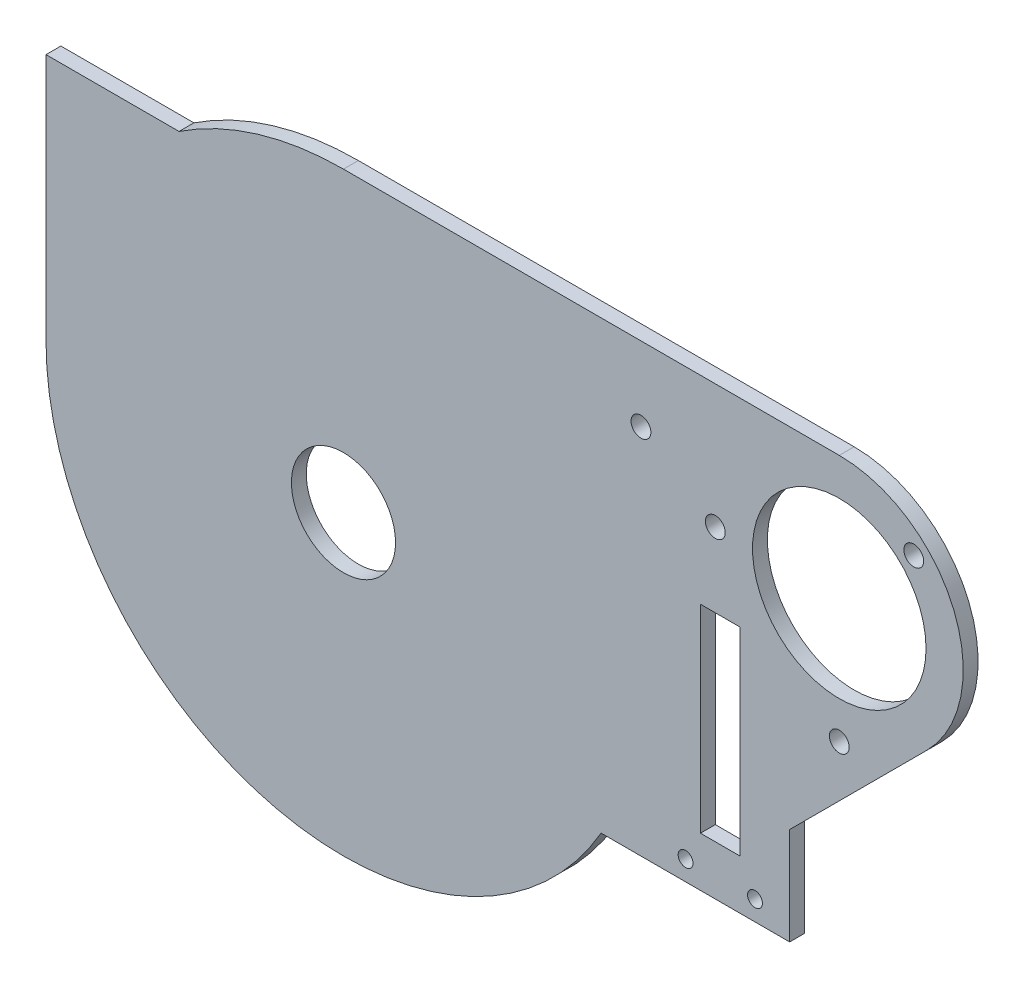
ISO-10303-21;
HEADER;
FILE_DESCRIPTION(('STEP AP214'),'2;1');
FILE_NAME('part.step','',(''),(''),'','','');
FILE_SCHEMA(('AUTOMOTIVE_DESIGN { 1 0 10303 214 1 1 1 1 }'));
ENDSEC;
DATA;
#1=APPLICATION_CONTEXT('core data for automotive mechanical design processes');
#2=APPLICATION_PROTOCOL_DEFINITION('international standard','automotive_design',2000,#1);
#3=PRODUCT_CONTEXT('',#1,'mechanical');
#4=PRODUCT('Part','Part','',(#3));
#5=PRODUCT_RELATED_PRODUCT_CATEGORY('part','',(#4));
#6=PRODUCT_DEFINITION_FORMATION('','',#4);
#7=PRODUCT_DEFINITION_CONTEXT('part definition',#1,'design');
#8=PRODUCT_DEFINITION('design','',#6,#7);
#9=PRODUCT_DEFINITION_SHAPE('','',#8);
#10=(LENGTH_UNIT() NAMED_UNIT(*) SI_UNIT(.MILLI.,.METRE.));
#11=(NAMED_UNIT(*) PLANE_ANGLE_UNIT() SI_UNIT($,.RADIAN.));
#12=(NAMED_UNIT(*) SI_UNIT($,.STERADIAN.) SOLID_ANGLE_UNIT());
#13=UNCERTAINTY_MEASURE_WITH_UNIT(LENGTH_MEASURE(1.E-05),#10,'distance_accuracy_value','');
#14=(GEOMETRIC_REPRESENTATION_CONTEXT(3) GLOBAL_UNCERTAINTY_ASSIGNED_CONTEXT((#13)) GLOBAL_UNIT_ASSIGNED_CONTEXT((#10,
#11,#12)) REPRESENTATION_CONTEXT('',''));
#15=CARTESIAN_POINT('',(0.,0.,0.));
#16=DIRECTION('',(0.,0.,1.));
#17=DIRECTION('',(1.,0.,0.));
#18=AXIS2_PLACEMENT_3D('',#15,#16,#17);
#19=CARTESIAN_POINT('',(0.,20.,3.));
#20=DIRECTION('',(0.,1.,0.));
#21=DIRECTION('',(0.,0.,1.));
#22=AXIS2_PLACEMENT_3D('',#19,#20,#21);
#23=PLANE('',#22);
#24=DIRECTION('',(1.,0.,0.));
#25=VECTOR('',#24,1.);
#26=CARTESIAN_POINT('',(0.,20.,0.));
#27=LINE('',#26,#25);
#28=CARTESIAN_POINT('',(72.,20.,0.));
#29=VERTEX_POINT('',#28);
#30=CARTESIAN_POINT('',(80.,20.,0.));
#31=VERTEX_POINT('',#30);
#32=EDGE_CURVE('E200',#29,#31,#27,.T.);
#33=ORIENTED_EDGE('',*,*,#32,.T.);
#34=DIRECTION('',(0.,0.,-1.));
#35=VECTOR('',#34,1.);
#36=CARTESIAN_POINT('',(80.,20.,3.));
#37=LINE('',#36,#35);
#38=CARTESIAN_POINT('',(80.,20.,3.));
#39=VERTEX_POINT('',#38);
#40=EDGE_CURVE('E11',#39,#31,#37,.T.);
#41=ORIENTED_EDGE('',*,*,#40,.F.);
#42=DIRECTION('',(1.,0.,0.));
#43=VECTOR('',#42,1.);
#44=CARTESIAN_POINT('',(0.,20.,3.));
#45=LINE('',#44,#43);
#46=CARTESIAN_POINT('',(72.,20.,3.));
#47=VERTEX_POINT('',#46);
#48=EDGE_CURVE('E147',#47,#39,#45,.T.);
#49=ORIENTED_EDGE('',*,*,#48,.F.);
#50=DIRECTION('',(0.,0.,-1.));
#51=VECTOR('',#50,1.);
#52=CARTESIAN_POINT('',(72.,20.,3.));
#53=LINE('',#52,#51);
#54=EDGE_CURVE('E56',#47,#29,#53,.T.);
#55=ORIENTED_EDGE('',*,*,#54,.T.);
#56=EDGE_LOOP('',(#33,#41,#49,#55));
#57=FACE_BOUND('',#56,.T.);
#58=ADVANCED_FACE('F37',(#57),#23,.F.);
#59=CARTESIAN_POINT('',(80.,0.,3.));
#60=DIRECTION('',(1.,0.,0.));
#61=DIRECTION('',(0.,0.,-1.));
#62=AXIS2_PLACEMENT_3D('',#59,#60,#61);
#63=PLANE('',#62);
#64=DIRECTION('',(0.,-1.,0.));
#65=VECTOR('',#64,1.);
#66=CARTESIAN_POINT('',(80.,0.,0.));
#67=LINE('',#66,#65);
#68=CARTESIAN_POINT('',(80.,-20.,0.));
#69=VERTEX_POINT('',#68);
#70=EDGE_CURVE('E153',#31,#69,#67,.T.);
#71=ORIENTED_EDGE('',*,*,#70,.T.);
#72=DIRECTION('',(0.,0.,-1.));
#73=VECTOR('',#72,1.);
#74=CARTESIAN_POINT('',(80.,-20.,3.));
#75=LINE('',#74,#73);
#76=CARTESIAN_POINT('',(80.,-20.,3.));
#77=VERTEX_POINT('',#76);
#78=EDGE_CURVE('E47',#77,#69,#75,.T.);
#79=ORIENTED_EDGE('',*,*,#78,.F.);
#80=DIRECTION('',(0.,-1.,0.));
#81=VECTOR('',#80,1.);
#82=CARTESIAN_POINT('',(80.,0.,3.));
#83=LINE('',#82,#81);
#84=EDGE_CURVE('E140',#39,#77,#83,.T.);
#85=ORIENTED_EDGE('',*,*,#84,.F.);
#86=ORIENTED_EDGE('',*,*,#40,.T.);
#87=EDGE_LOOP('',(#71,#79,#85,#86));
#88=FACE_BOUND('',#87,.T.);
#89=ADVANCED_FACE('F152',(#88),#63,.F.);
#90=CARTESIAN_POINT('',(0.,-20.,3.));
#91=DIRECTION('',(0.,1.,0.));
#92=DIRECTION('',(0.,0.,1.));
#93=AXIS2_PLACEMENT_3D('',#90,#91,#92);
#94=PLANE('',#93);
#95=DIRECTION('',(1.,0.,0.));
#96=VECTOR('',#95,1.);
#97=CARTESIAN_POINT('',(0.,-20.,0.));
#98=LINE('',#97,#96);
#99=CARTESIAN_POINT('',(72.,-20.,0.));
#100=VERTEX_POINT('',#99);
#101=EDGE_CURVE('E203',#100,#69,#98,.T.);
#102=ORIENTED_EDGE('',*,*,#101,.F.);
#103=DIRECTION('',(0.,0.,-1.));
#104=VECTOR('',#103,1.);
#105=CARTESIAN_POINT('',(72.,-20.,3.));
#106=LINE('',#105,#104);
#107=CARTESIAN_POINT('',(72.,-20.,3.));
#108=VERTEX_POINT('',#107);
#109=EDGE_CURVE('E97',#108,#100,#106,.T.);
#110=ORIENTED_EDGE('',*,*,#109,.F.);
#111=DIRECTION('',(1.,0.,0.));
#112=VECTOR('',#111,1.);
#113=CARTESIAN_POINT('',(0.,-20.,3.));
#114=LINE('',#113,#112);
#115=EDGE_CURVE('E146',#108,#77,#114,.T.);
#116=ORIENTED_EDGE('',*,*,#115,.T.);
#117=ORIENTED_EDGE('',*,*,#78,.T.);
#118=EDGE_LOOP('',(#102,#110,#116,#117));
#119=FACE_BOUND('',#118,.T.);
#120=ADVANCED_FACE('F157',(#119),#94,.T.);
#121=CARTESIAN_POINT('',(-60.,0.,3.));
#122=DIRECTION('',(-1.,0.,0.));
#123=DIRECTION('',(0.,0.,1.));
#124=AXIS2_PLACEMENT_3D('',#121,#122,#123);
#125=PLANE('',#124);
#126=DIRECTION('',(0.,1.,0.));
#127=VECTOR('',#126,1.);
#128=CARTESIAN_POINT('',(-60.,0.,0.));
#129=LINE('',#128,#127);
#130=CARTESIAN_POINT('',(-60.,0.,0.));
#131=VERTEX_POINT('',#130);
#132=CARTESIAN_POINT('',(-60.,50.,0.));
#133=VERTEX_POINT('',#132);
#134=EDGE_CURVE('E173',#131,#133,#129,.T.);
#135=ORIENTED_EDGE('',*,*,#134,.F.);
#136=DIRECTION('',(0.,0.,-1.));
#137=VECTOR('',#136,1.);
#138=CARTESIAN_POINT('',(-60.,0.,3.));
#139=LINE('',#138,#137);
#140=CARTESIAN_POINT('',(-60.,0.,3.));
#141=VERTEX_POINT('',#140);
#142=EDGE_CURVE('E41',#141,#131,#139,.T.);
#143=ORIENTED_EDGE('',*,*,#142,.F.);
#144=DIRECTION('',(0.,1.,0.));
#145=VECTOR('',#144,1.);
#146=CARTESIAN_POINT('',(-60.,0.,3.));
#147=LINE('',#146,#145);
#148=CARTESIAN_POINT('',(-60.,50.,3.));
#149=VERTEX_POINT('',#148);
#150=EDGE_CURVE('E217',#141,#149,#147,.T.);
#151=ORIENTED_EDGE('',*,*,#150,.T.);
#152=DIRECTION('',(0.,0.,-1.));
#153=VECTOR('',#152,1.);
#154=CARTESIAN_POINT('',(-60.,50.,3.));
#155=LINE('',#154,#153);
#156=EDGE_CURVE('E172',#149,#133,#155,.T.);
#157=ORIENTED_EDGE('',*,*,#156,.T.);
#158=EDGE_LOOP('',(#135,#143,#151,#157));
#159=FACE_BOUND('',#158,.T.);
#160=ADVANCED_FACE('F39',(#159),#125,.T.);
#161=CARTESIAN_POINT('',(0.,0.,3.));
#162=DIRECTION('',(0.,0.,-1.));
#163=DIRECTION('',(-1.,0.,0.));
#164=AXIS2_PLACEMENT_3D('',#161,#162,#163);
#165=CYLINDRICAL_SURFACE('',#164,60.);
#166=CARTESIAN_POINT('',(0.,0.,0.));
#167=DIRECTION('',(0.,0.,1.));
#168=DIRECTION('',(1.,0.,0.));
#169=AXIS2_PLACEMENT_3D('',#166,#167,#168);
#170=CIRCLE('',#169,60.);
#171=CARTESIAN_POINT('',(51.9615242270663,-30.,0.));
#172=VERTEX_POINT('',#171);
#173=EDGE_CURVE('E176',#131,#172,#170,.T.);
#174=ORIENTED_EDGE('',*,*,#173,.T.);
#175=DIRECTION('',(0.,0.,-1.));
#176=VECTOR('',#175,1.);
#177=CARTESIAN_POINT('',(51.9615242270663,-30.,3.));
#178=LINE('',#177,#176);
#179=CARTESIAN_POINT('',(51.9615242270663,-30.,3.));
#180=VERTEX_POINT('',#179);
#181=EDGE_CURVE('E235',#180,#172,#178,.T.);
#182=ORIENTED_EDGE('',*,*,#181,.F.);
#183=CARTESIAN_POINT('',(0.,0.,3.));
#184=DIRECTION('',(0.,0.,1.));
#185=DIRECTION('',(1.,0.,0.));
#186=AXIS2_PLACEMENT_3D('',#183,#184,#185);
#187=CIRCLE('',#186,60.);
#188=EDGE_CURVE('E243',#141,#180,#187,.T.);
#189=ORIENTED_EDGE('',*,*,#188,.F.);
#190=ORIENTED_EDGE('',*,*,#142,.T.);
#191=EDGE_LOOP('',(#174,#182,#189,#190));
#192=FACE_BOUND('',#191,.T.);
#193=ADVANCED_FACE('F242',(#192),#165,.T.);
#194=CARTESIAN_POINT('',(0.,-30.,3.));
#195=DIRECTION('',(0.,-1.,0.));
#196=DIRECTION('',(0.,0.,-1.));
#197=AXIS2_PLACEMENT_3D('',#194,#195,#196);
#198=PLANE('',#197);
#199=DIRECTION('',(-1.,0.,0.));
#200=VECTOR('',#199,1.);
#201=CARTESIAN_POINT('',(0.,-30.,0.));
#202=LINE('',#201,#200);
#203=CARTESIAN_POINT('',(90.,-30.,0.));
#204=VERTEX_POINT('',#203);
#205=EDGE_CURVE('E180',#204,#172,#202,.T.);
#206=ORIENTED_EDGE('',*,*,#205,.F.);
#207=DIRECTION('',(0.,0.,-1.));
#208=VECTOR('',#207,1.);
#209=CARTESIAN_POINT('',(90.,-30.,3.));
#210=LINE('',#209,#208);
#211=CARTESIAN_POINT('',(90.,-30.,3.));
#212=VERTEX_POINT('',#211);
#213=EDGE_CURVE('E234',#212,#204,#210,.T.);
#214=ORIENTED_EDGE('',*,*,#213,.F.);
#215=DIRECTION('',(-1.,0.,0.));
#216=VECTOR('',#215,1.);
#217=CARTESIAN_POINT('',(0.,-30.,3.));
#218=LINE('',#217,#216);
#219=EDGE_CURVE('E282',#212,#180,#218,.T.);
#220=ORIENTED_EDGE('',*,*,#219,.T.);
#221=ORIENTED_EDGE('',*,*,#181,.T.);
#222=EDGE_LOOP('',(#206,#214,#220,#221));
#223=FACE_BOUND('',#222,.T.);
#224=ADVANCED_FACE('F281',(#223),#198,.T.);
#225=CARTESIAN_POINT('',(90.,0.,3.));
#226=DIRECTION('',(-1.,0.,0.));
#227=DIRECTION('',(0.,0.,1.));
#228=AXIS2_PLACEMENT_3D('',#225,#226,#227);
#229=PLANE('',#228);
#230=DIRECTION('',(0.,1.,0.));
#231=VECTOR('',#230,1.);
#232=CARTESIAN_POINT('',(90.,0.,0.));
#233=LINE('',#232,#231);
#234=CARTESIAN_POINT('',(90.,-10.3553390593274,0.));
#235=VERTEX_POINT('',#234);
#236=EDGE_CURVE('E184',#204,#235,#233,.T.);
#237=ORIENTED_EDGE('',*,*,#236,.T.);
#238=DIRECTION('',(0.,0.,-1.));
#239=VECTOR('',#238,1.);
#240=CARTESIAN_POINT('',(90.,-10.3553390593274,3.));
#241=LINE('',#240,#239);
#242=CARTESIAN_POINT('',(90.,-10.3553390593274,3.));
#243=VERTEX_POINT('',#242);
#244=EDGE_CURVE('E231',#243,#235,#241,.T.);
#245=ORIENTED_EDGE('',*,*,#244,.F.);
#246=DIRECTION('',(0.,1.,0.));
#247=VECTOR('',#246,1.);
#248=CARTESIAN_POINT('',(90.,0.,3.));
#249=LINE('',#248,#247);
#250=EDGE_CURVE('E279',#212,#243,#249,.T.);
#251=ORIENTED_EDGE('',*,*,#250,.F.);
#252=ORIENTED_EDGE('',*,*,#213,.T.);
#253=EDGE_LOOP('',(#237,#245,#251,#252));
#254=FACE_BOUND('',#253,.T.);
#255=ADVANCED_FACE('F278',(#254),#229,.F.);
#256=CARTESIAN_POINT('',(50.1776695296637,-50.1776695296637,3.));
#257=DIRECTION('',(-0.707106781186547,0.707106781186548,0.));
#258=DIRECTION('',(-0.707106781186548,-0.707106781186547,0.));
#259=AXIS2_PLACEMENT_3D('',#256,#257,#258);
#260=PLANE('',#259);
#261=DIRECTION('',(0.707106781186548,0.707106781186547,0.));
#262=VECTOR('',#261,1.);
#263=CARTESIAN_POINT('',(50.1776695296637,-50.1776695296637,0.));
#264=LINE('',#263,#262);
#265=CARTESIAN_POINT('',(117.677669529664,17.3223304703363,0.));
#266=VERTEX_POINT('',#265);
#267=EDGE_CURVE('E186',#235,#266,#264,.T.);
#268=ORIENTED_EDGE('',*,*,#267,.T.);
#269=DIRECTION('',(0.,0.,-1.));
#270=VECTOR('',#269,1.);
#271=CARTESIAN_POINT('',(117.677669529664,17.3223304703363,3.));
#272=LINE('',#271,#270);
#273=CARTESIAN_POINT('',(117.677669529664,17.3223304703363,3.));
#274=VERTEX_POINT('',#273);
#275=EDGE_CURVE('E228',#274,#266,#272,.T.);
#276=ORIENTED_EDGE('',*,*,#275,.F.);
#277=DIRECTION('',(0.707106781186548,0.707106781186547,0.));
#278=VECTOR('',#277,1.);
#279=CARTESIAN_POINT('',(50.1776695296637,-50.1776695296637,3.));
#280=LINE('',#279,#278);
#281=EDGE_CURVE('E275',#243,#274,#280,.T.);
#282=ORIENTED_EDGE('',*,*,#281,.F.);
#283=ORIENTED_EDGE('',*,*,#244,.T.);
#284=EDGE_LOOP('',(#268,#276,#282,#283));
#285=FACE_BOUND('',#284,.T.);
#286=ADVANCED_FACE('F272',(#285),#260,.F.);
#287=CARTESIAN_POINT('',(100.,35.,3.));
#288=DIRECTION('',(0.,0.,-1.));
#289=DIRECTION('',(-1.,0.,0.));
#290=AXIS2_PLACEMENT_3D('',#287,#288,#289);
#291=CYLINDRICAL_SURFACE('',#290,25.);
#292=CARTESIAN_POINT('',(100.,35.,0.));
#293=DIRECTION('',(0.,0.,1.));
#294=DIRECTION('',(1.,0.,0.));
#295=AXIS2_PLACEMENT_3D('',#292,#293,#294);
#296=CIRCLE('',#295,25.);
#297=CARTESIAN_POINT('',(100.,60.,0.));
#298=VERTEX_POINT('',#297);
#299=EDGE_CURVE('E188',#266,#298,#296,.T.);
#300=ORIENTED_EDGE('',*,*,#299,.T.);
#301=DIRECTION('',(0.,0.,-1.));
#302=VECTOR('',#301,1.);
#303=CARTESIAN_POINT('',(100.,60.,3.));
#304=LINE('',#303,#302);
#305=CARTESIAN_POINT('',(100.,60.,3.));
#306=VERTEX_POINT('',#305);
#307=EDGE_CURVE('E226',#306,#298,#304,.T.);
#308=ORIENTED_EDGE('',*,*,#307,.F.);
#309=CARTESIAN_POINT('',(100.,35.,3.));
#310=DIRECTION('',(0.,0.,1.));
#311=DIRECTION('',(1.,0.,0.));
#312=AXIS2_PLACEMENT_3D('',#309,#310,#311);
#313=CIRCLE('',#312,25.);
#314=EDGE_CURVE('E291',#274,#306,#313,.T.);
#315=ORIENTED_EDGE('',*,*,#314,.F.);
#316=ORIENTED_EDGE('',*,*,#275,.T.);
#317=EDGE_LOOP('',(#300,#308,#315,#316));
#318=FACE_BOUND('',#317,.T.);
#319=ADVANCED_FACE('F268',(#318),#291,.T.);
#320=CARTESIAN_POINT('',(0.,60.,3.));
#321=DIRECTION('',(0.,1.,0.));
#322=DIRECTION('',(-1.,0.,0.));
#323=AXIS2_PLACEMENT_3D('',#320,#321,#322);
#324=PLANE('',#323);
#325=DIRECTION('',(1.,0.,0.));
#326=VECTOR('',#325,1.);
#327=CARTESIAN_POINT('',(0.,60.,0.));
#328=LINE('',#327,#326);
#329=CARTESIAN_POINT('',(0.,60.,0.));
#330=VERTEX_POINT('',#329);
#331=EDGE_CURVE('E191',#330,#298,#328,.T.);
#332=ORIENTED_EDGE('',*,*,#331,.F.);
#333=DIRECTION('',(0.,0.,-1.));
#334=VECTOR('',#333,1.);
#335=CARTESIAN_POINT('',(0.,60.,3.));
#336=LINE('',#335,#334);
#337=CARTESIAN_POINT('',(0.,60.,3.));
#338=VERTEX_POINT('',#337);
#339=EDGE_CURVE('E224',#338,#330,#336,.T.);
#340=ORIENTED_EDGE('',*,*,#339,.F.);
#341=DIRECTION('',(1.,0.,0.));
#342=VECTOR('',#341,1.);
#343=CARTESIAN_POINT('',(0.,60.,3.));
#344=LINE('',#343,#342);
#345=EDGE_CURVE('E265',#338,#306,#344,.T.);
#346=ORIENTED_EDGE('',*,*,#345,.T.);
#347=ORIENTED_EDGE('',*,*,#307,.T.);
#348=EDGE_LOOP('',(#332,#340,#346,#347));
#349=FACE_BOUND('',#348,.T.);
#350=ADVANCED_FACE('F260',(#349),#324,.T.);
#351=CARTESIAN_POINT('',(-33.166247903554,50.,0.));
#352=VERTEX_POINT('',#351);
#353=EDGE_CURVE('E181',#330,#352,#170,.T.);
#354=ORIENTED_EDGE('',*,*,#353,.T.);
#355=DIRECTION('',(0.,0.,-1.));
#356=VECTOR('',#355,1.);
#357=CARTESIAN_POINT('',(-33.166247903554,50.,3.));
#358=LINE('',#357,#356);
#359=CARTESIAN_POINT('',(-33.166247903554,50.,3.));
#360=VERTEX_POINT('',#359);
#361=EDGE_CURVE('E221',#360,#352,#358,.T.);
#362=ORIENTED_EDGE('',*,*,#361,.F.);
#363=EDGE_CURVE('E287',#338,#360,#187,.T.);
#364=ORIENTED_EDGE('',*,*,#363,.F.);
#365=ORIENTED_EDGE('',*,*,#339,.T.);
#366=EDGE_LOOP('',(#354,#362,#364,#365));
#367=FACE_BOUND('',#366,.T.);
#368=ADVANCED_FACE('F332',(#367),#165,.T.);
#369=CARTESIAN_POINT('',(69.,-26.,3.));
#370=DIRECTION('',(0.,0.,-1.));
#371=DIRECTION('',(-1.,0.,0.));
#372=AXIS2_PLACEMENT_3D('',#369,#370,#371);
#373=CYLINDRICAL_SURFACE('',#372,1.5);
#374=CARTESIAN_POINT('',(69.,-26.,3.));
#375=DIRECTION('',(0.,0.,1.));
#376=DIRECTION('',(1.,0.,0.));
#377=AXIS2_PLACEMENT_3D('',#374,#375,#376);
#378=CIRCLE('',#377,1.5);
#379=CARTESIAN_POINT('',(70.5,-26.,3.));
#380=VERTEX_POINT('',#379);
#381=EDGE_CURVE('E166',#380,#380,#378,.T.);
#382=ORIENTED_EDGE('',*,*,#381,.T.);
#383=EDGE_LOOP('',(#382));
#384=FACE_BOUND('',#383,.T.);
#385=CARTESIAN_POINT('',(69.,-26.,0.));
#386=DIRECTION('',(0.,0.,1.));
#387=DIRECTION('',(1.,0.,0.));
#388=AXIS2_PLACEMENT_3D('',#385,#386,#387);
#389=CIRCLE('',#388,1.5);
#390=CARTESIAN_POINT('',(70.5,-26.,0.));
#391=VERTEX_POINT('',#390);
#392=EDGE_CURVE('E211',#391,#391,#389,.T.);
#393=ORIENTED_EDGE('',*,*,#392,.F.);
#394=EDGE_LOOP('',(#393));
#395=FACE_BOUND('',#394,.T.);
#396=ADVANCED_FACE('F335',(#384,#395),#373,.F.);
#397=CARTESIAN_POINT('',(100.,35.,3.));
#398=DIRECTION('',(0.,0.,-1.));
#399=DIRECTION('',(-1.,0.,0.));
#400=AXIS2_PLACEMENT_3D('',#397,#398,#399);
#401=CYLINDRICAL_SURFACE('',#400,17.5);
#402=CARTESIAN_POINT('',(100.,35.,3.));
#403=DIRECTION('',(0.,0.,1.));
#404=DIRECTION('',(1.,0.,0.));
#405=AXIS2_PLACEMENT_3D('',#402,#403,#404);
#406=CIRCLE('',#405,17.5);
#407=CARTESIAN_POINT('',(117.5,35.,3.));
#408=VERTEX_POINT('',#407);
#409=EDGE_CURVE('E160',#408,#408,#406,.T.);
#410=ORIENTED_EDGE('',*,*,#409,.T.);
#411=EDGE_LOOP('',(#410));
#412=FACE_BOUND('',#411,.T.);
#413=CARTESIAN_POINT('',(100.,35.,0.));
#414=DIRECTION('',(0.,0.,1.));
#415=DIRECTION('',(1.,0.,0.));
#416=AXIS2_PLACEMENT_3D('',#413,#414,#415);
#417=CIRCLE('',#416,17.5);
#418=CARTESIAN_POINT('',(117.5,35.,0.));
#419=VERTEX_POINT('',#418);
#420=EDGE_CURVE('E208',#419,#419,#417,.T.);
#421=ORIENTED_EDGE('',*,*,#420,.F.);
#422=EDGE_LOOP('',(#421));
#423=FACE_BOUND('',#422,.T.);
#424=ADVANCED_FACE('F358',(#412,#423),#401,.F.);
#425=CARTESIAN_POINT('',(72.,0.,3.));
#426=DIRECTION('',(1.,0.,0.));
#427=DIRECTION('',(0.,0.,-1.));
#428=AXIS2_PLACEMENT_3D('',#425,#426,#427);
#429=PLANE('',#428);
#430=DIRECTION('',(0.,-1.,0.));
#431=VECTOR('',#430,1.);
#432=CARTESIAN_POINT('',(72.,0.,0.));
#433=LINE('',#432,#431);
#434=EDGE_CURVE('E205',#29,#100,#433,.T.);
#435=ORIENTED_EDGE('',*,*,#434,.F.);
#436=ORIENTED_EDGE('',*,*,#54,.F.);
#437=DIRECTION('',(0.,-1.,0.));
#438=VECTOR('',#437,1.);
#439=CARTESIAN_POINT('',(72.,0.,3.));
#440=LINE('',#439,#438);
#441=EDGE_CURVE('E158',#47,#108,#440,.T.);
#442=ORIENTED_EDGE('',*,*,#441,.T.);
#443=ORIENTED_EDGE('',*,*,#109,.T.);
#444=EDGE_LOOP('',(#435,#436,#442,#443));
#445=FACE_BOUND('',#444,.T.);
#446=ADVANCED_FACE('F329',(#445),#429,.T.);
#447=CARTESIAN_POINT('',(0.,0.,3.));
#448=DIRECTION('',(0.,0.,-1.));
#449=DIRECTION('',(-1.,0.,0.));
#450=AXIS2_PLACEMENT_3D('',#447,#448,#449);
#451=CYLINDRICAL_SURFACE('',#450,10.5);
#452=CARTESIAN_POINT('',(0.,0.,3.));
#453=DIRECTION('',(0.,0.,1.));
#454=DIRECTION('',(1.,0.,0.));
#455=AXIS2_PLACEMENT_3D('',#452,#453,#454);
#456=CIRCLE('',#455,10.5);
#457=CARTESIAN_POINT('',(10.5,0.,3.));
#458=VERTEX_POINT('',#457);
#459=EDGE_CURVE('E296',#458,#458,#456,.T.);
#460=ORIENTED_EDGE('',*,*,#459,.T.);
#461=EDGE_LOOP('',(#460));
#462=FACE_BOUND('',#461,.T.);
#463=CARTESIAN_POINT('',(0.,0.,0.));
#464=DIRECTION('',(0.,0.,1.));
#465=DIRECTION('',(1.,0.,0.));
#466=AXIS2_PLACEMENT_3D('',#463,#464,#465);
#467=CIRCLE('',#466,10.5);
#468=CARTESIAN_POINT('',(10.5,0.,0.));
#469=VERTEX_POINT('',#468);
#470=EDGE_CURVE('E197',#469,#469,#467,.T.);
#471=ORIENTED_EDGE('',*,*,#470,.F.);
#472=EDGE_LOOP('',(#471));
#473=FACE_BOUND('',#472,.T.);
#474=ADVANCED_FACE('F300',(#462,#473),#451,.F.);
#475=CARTESIAN_POINT('',(0.,50.,3.));
#476=DIRECTION('',(0.,-1.,0.));
#477=DIRECTION('',(0.,0.,-1.));
#478=AXIS2_PLACEMENT_3D('',#475,#476,#477);
#479=PLANE('',#478);
#480=DIRECTION('',(-1.,0.,0.));
#481=VECTOR('',#480,1.);
#482=CARTESIAN_POINT('',(0.,50.,0.));
#483=LINE('',#482,#481);
#484=EDGE_CURVE('E194',#352,#133,#483,.T.);
#485=ORIENTED_EDGE('',*,*,#484,.T.);
#486=ORIENTED_EDGE('',*,*,#156,.F.);
#487=DIRECTION('',(-1.,0.,0.));
#488=VECTOR('',#487,1.);
#489=CARTESIAN_POINT('',(0.,50.,3.));
#490=LINE('',#489,#488);
#491=EDGE_CURVE('E294',#360,#149,#490,.T.);
#492=ORIENTED_EDGE('',*,*,#491,.F.);
#493=ORIENTED_EDGE('',*,*,#361,.T.);
#494=EDGE_LOOP('',(#485,#486,#492,#493));
#495=FACE_BOUND('',#494,.T.);
#496=ADVANCED_FACE('F253',(#495),#479,.F.);
#497=CARTESIAN_POINT('',(83.,-26.,3.));
#498=DIRECTION('',(0.,0.,-1.));
#499=DIRECTION('',(-1.,0.,0.));
#500=AXIS2_PLACEMENT_3D('',#497,#498,#499);
#501=CYLINDRICAL_SURFACE('',#500,1.5);
#502=CARTESIAN_POINT('',(83.,-26.,3.));
#503=DIRECTION('',(0.,0.,1.));
#504=DIRECTION('',(1.,0.,0.));
#505=AXIS2_PLACEMENT_3D('',#502,#503,#504);
#506=CIRCLE('',#505,1.5);
#507=CARTESIAN_POINT('',(84.5,-26.,3.));
#508=VERTEX_POINT('',#507);
#509=EDGE_CURVE('E169',#508,#508,#506,.F.);
#510=ORIENTED_EDGE('',*,*,#509,.F.);
#511=EDGE_LOOP('',(#510));
#512=FACE_BOUND('',#511,.T.);
#513=CARTESIAN_POINT('',(83.,-26.,0.));
#514=DIRECTION('',(0.,0.,1.));
#515=DIRECTION('',(1.,0.,0.));
#516=AXIS2_PLACEMENT_3D('',#513,#514,#515);
#517=CIRCLE('',#516,1.5);
#518=CARTESIAN_POINT('',(84.5,-26.,0.));
#519=VERTEX_POINT('',#518);
#520=EDGE_CURVE('E214',#519,#519,#517,.F.);
#521=ORIENTED_EDGE('',*,*,#520,.T.);
#522=EDGE_LOOP('',(#521));
#523=FACE_BOUND('',#522,.T.);
#524=ADVANCED_FACE('F304',(#512,#523),#501,.F.);
#525=CARTESIAN_POINT('',(0.,0.,3.));
#526=DIRECTION('',(0.,0.,1.));
#527=DIRECTION('',(1.,0.,0.));
#528=AXIS2_PLACEMENT_3D('',#525,#526,#527);
#529=PLANE('',#528);
#530=CARTESIAN_POINT('',(100.,9.99999999999998,3.));
#531=DIRECTION('',(0.,0.,1.));
#532=DIRECTION('',(1.,0.,0.));
#533=AXIS2_PLACEMENT_3D('',#530,#531,#532);
#534=CIRCLE('',#533,2.);
#535=CARTESIAN_POINT('',(102.,9.99999999999998,3.));
#536=VERTEX_POINT('',#535);
#537=EDGE_CURVE('E454',#536,#536,#534,.T.);
#538=ORIENTED_EDGE('',*,*,#537,.F.);
#539=EDGE_LOOP('',(#538));
#540=FACE_BOUND('',#539,.T.);
#541=CARTESIAN_POINT('',(75.,35.,3.));
#542=DIRECTION('',(0.,0.,1.));
#543=DIRECTION('',(1.,0.,0.));
#544=AXIS2_PLACEMENT_3D('',#541,#542,#543);
#545=CIRCLE('',#544,2.);
#546=CARTESIAN_POINT('',(77.,35.,3.));
#547=VERTEX_POINT('',#546);
#548=EDGE_CURVE('E465',#547,#547,#545,.T.);
#549=ORIENTED_EDGE('',*,*,#548,.F.);
#550=EDGE_LOOP('',(#549));
#551=FACE_BOUND('',#550,.T.);
#552=CARTESIAN_POINT('',(115.026019100214,50.0260191002142,3.));
#553=DIRECTION('',(0.,0.,1.));
#554=DIRECTION('',(1.,0.,0.));
#555=AXIS2_PLACEMENT_3D('',#552,#553,#554);
#556=CIRCLE('',#555,2.);
#557=CARTESIAN_POINT('',(117.026019100214,50.0260191002142,3.));
#558=VERTEX_POINT('',#557);
#559=EDGE_CURVE('E471',#558,#558,#556,.T.);
#560=ORIENTED_EDGE('',*,*,#559,.F.);
#561=EDGE_LOOP('',(#560));
#562=FACE_BOUND('',#561,.T.);
#563=CARTESIAN_POINT('',(60.,45.,3.));
#564=DIRECTION('',(0.,0.,1.));
#565=DIRECTION('',(1.,0.,0.));
#566=AXIS2_PLACEMENT_3D('',#563,#564,#565);
#567=CIRCLE('',#566,2.);
#568=CARTESIAN_POINT('',(62.,45.,3.));
#569=VERTEX_POINT('',#568);
#570=EDGE_CURVE('E458',#569,#569,#567,.T.);
#571=ORIENTED_EDGE('',*,*,#570,.F.);
#572=EDGE_LOOP('',(#571));
#573=FACE_BOUND('',#572,.T.);
#574=ORIENTED_EDGE('',*,*,#150,.F.);
#575=ORIENTED_EDGE('',*,*,#188,.T.);
#576=ORIENTED_EDGE('',*,*,#219,.F.);
#577=ORIENTED_EDGE('',*,*,#250,.T.);
#578=ORIENTED_EDGE('',*,*,#281,.T.);
#579=ORIENTED_EDGE('',*,*,#314,.T.);
#580=ORIENTED_EDGE('',*,*,#345,.F.);
#581=ORIENTED_EDGE('',*,*,#363,.T.);
#582=ORIENTED_EDGE('',*,*,#491,.T.);
#583=EDGE_LOOP('',(#574,#575,#576,#577,#578,#579,#580,#581,#582));
#584=FACE_BOUND('',#583,.T.);
#585=ORIENTED_EDGE('',*,*,#459,.F.);
#586=EDGE_LOOP('',(#585));
#587=FACE_BOUND('',#586,.T.);
#588=ORIENTED_EDGE('',*,*,#48,.T.);
#589=ORIENTED_EDGE('',*,*,#84,.T.);
#590=ORIENTED_EDGE('',*,*,#115,.F.);
#591=ORIENTED_EDGE('',*,*,#441,.F.);
#592=EDGE_LOOP('',(#588,#589,#590,#591));
#593=FACE_BOUND('',#592,.T.);
#594=ORIENTED_EDGE('',*,*,#409,.F.);
#595=EDGE_LOOP('',(#594));
#596=FACE_BOUND('',#595,.T.);
#597=ORIENTED_EDGE('',*,*,#381,.F.);
#598=EDGE_LOOP('',(#597));
#599=FACE_BOUND('',#598,.T.);
#600=ORIENTED_EDGE('',*,*,#509,.T.);
#601=EDGE_LOOP('',(#600));
#602=FACE_BOUND('',#601,.T.);
#603=ADVANCED_FACE('F142',(#540,#551,#562,#573,#584,#587,#593,#596,#599,#602),#529,.T.);
#604=CARTESIAN_POINT('',(0.,0.,0.));
#605=DIRECTION('',(0.,0.,1.));
#606=DIRECTION('',(1.,0.,0.));
#607=AXIS2_PLACEMENT_3D('',#604,#605,#606);
#608=PLANE('',#607);
#609=CARTESIAN_POINT('',(100.,9.99999999999998,0.));
#610=DIRECTION('',(0.,0.,1.));
#611=DIRECTION('',(1.,0.,0.));
#612=AXIS2_PLACEMENT_3D('',#609,#610,#611);
#613=CIRCLE('',#612,2.);
#614=CARTESIAN_POINT('',(102.,9.99999999999998,0.));
#615=VERTEX_POINT('',#614);
#616=EDGE_CURVE('E457',#615,#615,#613,.F.);
#617=ORIENTED_EDGE('',*,*,#616,.F.);
#618=EDGE_LOOP('',(#617));
#619=FACE_BOUND('',#618,.T.);
#620=CARTESIAN_POINT('',(75.,35.,0.));
#621=DIRECTION('',(0.,0.,1.));
#622=DIRECTION('',(1.,0.,0.));
#623=AXIS2_PLACEMENT_3D('',#620,#621,#622);
#624=CIRCLE('',#623,2.);
#625=CARTESIAN_POINT('',(77.,35.,0.));
#626=VERTEX_POINT('',#625);
#627=EDGE_CURVE('E462',#626,#626,#624,.F.);
#628=ORIENTED_EDGE('',*,*,#627,.F.);
#629=EDGE_LOOP('',(#628));
#630=FACE_BOUND('',#629,.T.);
#631=CARTESIAN_POINT('',(115.026019100214,50.0260191002142,0.));
#632=DIRECTION('',(0.,0.,1.));
#633=DIRECTION('',(1.,0.,0.));
#634=AXIS2_PLACEMENT_3D('',#631,#632,#633);
#635=CIRCLE('',#634,2.);
#636=CARTESIAN_POINT('',(117.026019100214,50.0260191002142,0.));
#637=VERTEX_POINT('',#636);
#638=EDGE_CURVE('E468',#637,#637,#635,.F.);
#639=ORIENTED_EDGE('',*,*,#638,.F.);
#640=EDGE_LOOP('',(#639));
#641=FACE_BOUND('',#640,.T.);
#642=CARTESIAN_POINT('',(60.,45.,0.));
#643=DIRECTION('',(0.,0.,1.));
#644=DIRECTION('',(1.,0.,0.));
#645=AXIS2_PLACEMENT_3D('',#642,#643,#644);
#646=CIRCLE('',#645,2.);
#647=CARTESIAN_POINT('',(62.,45.,0.));
#648=VERTEX_POINT('',#647);
#649=EDGE_CURVE('E177',#648,#648,#646,.F.);
#650=ORIENTED_EDGE('',*,*,#649,.F.);
#651=EDGE_LOOP('',(#650));
#652=FACE_BOUND('',#651,.T.);
#653=ORIENTED_EDGE('',*,*,#134,.T.);
#654=ORIENTED_EDGE('',*,*,#484,.F.);
#655=ORIENTED_EDGE('',*,*,#353,.F.);
#656=ORIENTED_EDGE('',*,*,#331,.T.);
#657=ORIENTED_EDGE('',*,*,#299,.F.);
#658=ORIENTED_EDGE('',*,*,#267,.F.);
#659=ORIENTED_EDGE('',*,*,#236,.F.);
#660=ORIENTED_EDGE('',*,*,#205,.T.);
#661=ORIENTED_EDGE('',*,*,#173,.F.);
#662=EDGE_LOOP('',(#653,#654,#655,#656,#657,#658,#659,#660,#661));
#663=FACE_BOUND('',#662,.T.);
#664=ORIENTED_EDGE('',*,*,#470,.T.);
#665=EDGE_LOOP('',(#664));
#666=FACE_BOUND('',#665,.T.);
#667=ORIENTED_EDGE('',*,*,#32,.F.);
#668=ORIENTED_EDGE('',*,*,#434,.T.);
#669=ORIENTED_EDGE('',*,*,#101,.T.);
#670=ORIENTED_EDGE('',*,*,#70,.F.);
#671=EDGE_LOOP('',(#667,#668,#669,#670));
#672=FACE_BOUND('',#671,.T.);
#673=ORIENTED_EDGE('',*,*,#420,.T.);
#674=EDGE_LOOP('',(#673));
#675=FACE_BOUND('',#674,.T.);
#676=ORIENTED_EDGE('',*,*,#392,.T.);
#677=EDGE_LOOP('',(#676));
#678=FACE_BOUND('',#677,.T.);
#679=ORIENTED_EDGE('',*,*,#520,.F.);
#680=EDGE_LOOP('',(#679));
#681=FACE_BOUND('',#680,.T.);
#682=ADVANCED_FACE('F246',(#619,#630,#641,#652,#663,#666,#672,#675,#678,#681),#608,.F.);
#683=CARTESIAN_POINT('',(60.,45.,-0.00100000000000013));
#684=DIRECTION('',(0.,0.,1.));
#685=DIRECTION('',(1.,0.,0.));
#686=AXIS2_PLACEMENT_3D('',#683,#684,#685);
#687=CYLINDRICAL_SURFACE('',#686,2.);
#688=CARTESIAN_POINT('',(62.,45.,3.));
#689=CARTESIAN_POINT('',(62.,45.,2.96875));
#690=CARTESIAN_POINT('',(62.,45.,2.9375));
#691=CARTESIAN_POINT('',(62.,45.,2.875));
#692=CARTESIAN_POINT('',(62.,45.,2.84375));
#693=CARTESIAN_POINT('',(62.,45.,2.78125));
#694=CARTESIAN_POINT('',(62.,45.,2.75));
#695=CARTESIAN_POINT('',(62.,45.,2.6875));
#696=CARTESIAN_POINT('',(62.,45.,2.65625));
#697=CARTESIAN_POINT('',(62.,45.,2.59375));
#698=CARTESIAN_POINT('',(62.,45.,2.5625));
#699=CARTESIAN_POINT('',(62.,45.,2.5));
#700=CARTESIAN_POINT('',(62.,45.,2.46875));
#701=CARTESIAN_POINT('',(62.,45.,2.40625));
#702=CARTESIAN_POINT('',(62.,45.,2.375));
#703=CARTESIAN_POINT('',(62.,45.,2.3125));
#704=CARTESIAN_POINT('',(62.,45.,2.28125));
#705=CARTESIAN_POINT('',(62.,45.,2.21875));
#706=CARTESIAN_POINT('',(62.,45.,2.1875));
#707=CARTESIAN_POINT('',(62.,45.,2.125));
#708=CARTESIAN_POINT('',(62.,45.,2.09375));
#709=CARTESIAN_POINT('',(62.,45.,2.03125));
#710=CARTESIAN_POINT('',(62.,45.,2.));
#711=CARTESIAN_POINT('',(62.,45.,1.9375));
#712=CARTESIAN_POINT('',(62.,45.,1.90625));
#713=CARTESIAN_POINT('',(62.,45.,1.84375));
#714=CARTESIAN_POINT('',(62.,45.,1.8125));
#715=CARTESIAN_POINT('',(62.,45.,1.75));
#716=CARTESIAN_POINT('',(62.,45.,1.71875));
#717=CARTESIAN_POINT('',(62.,45.,1.65625));
#718=CARTESIAN_POINT('',(62.,45.,1.625));
#719=CARTESIAN_POINT('',(62.,45.,1.5625));
#720=CARTESIAN_POINT('',(62.,45.,1.53125));
#721=CARTESIAN_POINT('',(62.,45.,1.46875));
#722=CARTESIAN_POINT('',(62.,45.,1.4375));
#723=CARTESIAN_POINT('',(62.,45.,1.375));
#724=CARTESIAN_POINT('',(62.,45.,1.34375));
#725=CARTESIAN_POINT('',(62.,45.,1.28125));
#726=CARTESIAN_POINT('',(62.,45.,1.25));
#727=CARTESIAN_POINT('',(62.,45.,1.1875));
#728=CARTESIAN_POINT('',(62.,45.,1.15625));
#729=CARTESIAN_POINT('',(62.,45.,1.09375));
#730=CARTESIAN_POINT('',(62.,45.,1.0625));
#731=CARTESIAN_POINT('',(62.,45.,1.));
#732=CARTESIAN_POINT('',(62.,45.,0.96875));
#733=CARTESIAN_POINT('',(62.,45.,0.90625));
#734=CARTESIAN_POINT('',(62.,45.,0.875));
#735=CARTESIAN_POINT('',(62.,45.,0.8125));
#736=CARTESIAN_POINT('',(62.,45.,0.78125));
#737=CARTESIAN_POINT('',(62.,45.,0.71875));
#738=CARTESIAN_POINT('',(62.,45.,0.6875));
#739=CARTESIAN_POINT('',(62.,45.,0.625));
#740=CARTESIAN_POINT('',(62.,45.,0.59375));
#741=CARTESIAN_POINT('',(62.,45.,0.53125));
#742=CARTESIAN_POINT('',(62.,45.,0.5));
#743=CARTESIAN_POINT('',(62.,45.,0.4375));
#744=CARTESIAN_POINT('',(62.,45.,0.40625));
#745=CARTESIAN_POINT('',(62.,45.,0.34375));
#746=CARTESIAN_POINT('',(62.,45.,0.3125));
#747=CARTESIAN_POINT('',(62.,45.,0.25));
#748=CARTESIAN_POINT('',(62.,45.,0.21875));
#749=CARTESIAN_POINT('',(62.,45.,0.15625));
#750=CARTESIAN_POINT('',(62.,45.,0.125));
#751=CARTESIAN_POINT('',(62.,45.,0.0625000000000001));
#752=CARTESIAN_POINT('',(62.,45.,0.0312500000000001));
#753=CARTESIAN_POINT('',(62.,45.,0.));
#754=B_SPLINE_CURVE_WITH_KNOTS('',3,(#688,#689,#690,#691,#692,#693,#694,#695,#696,#697,#698,
#699,#700,#701,#702,#703,#704,#705,#706,#707,#708,#709,#710,#711,#712,#713,#714,#715,#716,#717,
#718,#719,#720,#721,#722,#723,#724,#725,#726,#727,#728,#729,#730,#731,#732,#733,#734,#735,#736,
#737,#738,#739,#740,#741,#742,#743,#744,#745,#746,#747,#748,#749,#750,#751,#752,#753),
.UNSPECIFIED.,.F.,.F.,(4,2,2,2,2,2,2,2,2,2,2,2,2,2,2,2,2,2,2,2,2,2,2,2,2,2,2,2,2,2,2,2,4),(0.,
0.0937500000000001,0.1875,0.28125,0.375,0.46875,0.5625,0.65625,0.75,0.84375,0.9375,1.03125,
1.125,1.21875,1.3125,1.40625,1.5,1.59375,1.6875,1.78125,1.875,1.96875,2.0625,2.15625,2.25,
2.34375,2.4375,2.53125,2.625,2.71875,2.8125,2.90625,3.),.UNSPECIFIED.);
#755=EDGE_CURVE('BSEAM311',#569,#648,#754,.T.);
#756=ORIENTED_EDGE('',*,*,#570,.T.);
#757=ORIENTED_EDGE('',*,*,#649,.T.);
#758=ORIENTED_EDGE('',*,*,#755,.T.);
#759=ORIENTED_EDGE('',*,*,#755,.F.);
#760=EDGE_LOOP('',(#756,#758,#757,#759));
#761=FACE_BOUND('',#760,.T.);
#762=ADVANCED_FACE('F311',(#761),#687,.F.);
#763=CARTESIAN_POINT('',(115.026019100214,50.0260191002142,-0.00100000000000013));
#764=DIRECTION('',(0.,0.,1.));
#765=DIRECTION('',(1.,0.,0.));
#766=AXIS2_PLACEMENT_3D('',#763,#764,#765);
#767=CYLINDRICAL_SURFACE('',#766,2.);
#768=CARTESIAN_POINT('',(117.026019100214,50.0260191002142,3.));
#769=CARTESIAN_POINT('',(117.026019100214,50.0260191002142,2.96875));
#770=CARTESIAN_POINT('',(117.026019100214,50.0260191002142,2.9375));
#771=CARTESIAN_POINT('',(117.026019100214,50.0260191002142,2.875));
#772=CARTESIAN_POINT('',(117.026019100214,50.0260191002142,2.84375));
#773=CARTESIAN_POINT('',(117.026019100214,50.0260191002142,2.78125));
#774=CARTESIAN_POINT('',(117.026019100214,50.0260191002142,2.75));
#775=CARTESIAN_POINT('',(117.026019100214,50.0260191002142,2.6875));
#776=CARTESIAN_POINT('',(117.026019100214,50.0260191002142,2.65625));
#777=CARTESIAN_POINT('',(117.026019100214,50.0260191002142,2.59375));
#778=CARTESIAN_POINT('',(117.026019100214,50.0260191002142,2.5625));
#779=CARTESIAN_POINT('',(117.026019100214,50.0260191002142,2.5));
#780=CARTESIAN_POINT('',(117.026019100214,50.0260191002142,2.46875));
#781=CARTESIAN_POINT('',(117.026019100214,50.0260191002142,2.40625));
#782=CARTESIAN_POINT('',(117.026019100214,50.0260191002142,2.375));
#783=CARTESIAN_POINT('',(117.026019100214,50.0260191002142,2.3125));
#784=CARTESIAN_POINT('',(117.026019100214,50.0260191002142,2.28125));
#785=CARTESIAN_POINT('',(117.026019100214,50.0260191002142,2.21875));
#786=CARTESIAN_POINT('',(117.026019100214,50.0260191002142,2.1875));
#787=CARTESIAN_POINT('',(117.026019100214,50.0260191002142,2.125));
#788=CARTESIAN_POINT('',(117.026019100214,50.0260191002142,2.09375));
#789=CARTESIAN_POINT('',(117.026019100214,50.0260191002142,2.03125));
#790=CARTESIAN_POINT('',(117.026019100214,50.0260191002142,2.));
#791=CARTESIAN_POINT('',(117.026019100214,50.0260191002142,1.9375));
#792=CARTESIAN_POINT('',(117.026019100214,50.0260191002142,1.90625));
#793=CARTESIAN_POINT('',(117.026019100214,50.0260191002142,1.84375));
#794=CARTESIAN_POINT('',(117.026019100214,50.0260191002142,1.8125));
#795=CARTESIAN_POINT('',(117.026019100214,50.0260191002142,1.75));
#796=CARTESIAN_POINT('',(117.026019100214,50.0260191002142,1.71875));
#797=CARTESIAN_POINT('',(117.026019100214,50.0260191002142,1.65625));
#798=CARTESIAN_POINT('',(117.026019100214,50.0260191002142,1.625));
#799=CARTESIAN_POINT('',(117.026019100214,50.0260191002142,1.5625));
#800=CARTESIAN_POINT('',(117.026019100214,50.0260191002142,1.53125));
#801=CARTESIAN_POINT('',(117.026019100214,50.0260191002142,1.46875));
#802=CARTESIAN_POINT('',(117.026019100214,50.0260191002142,1.4375));
#803=CARTESIAN_POINT('',(117.026019100214,50.0260191002142,1.375));
#804=CARTESIAN_POINT('',(117.026019100214,50.0260191002142,1.34375));
#805=CARTESIAN_POINT('',(117.026019100214,50.0260191002142,1.28125));
#806=CARTESIAN_POINT('',(117.026019100214,50.0260191002142,1.25));
#807=CARTESIAN_POINT('',(117.026019100214,50.0260191002142,1.1875));
#808=CARTESIAN_POINT('',(117.026019100214,50.0260191002142,1.15625));
#809=CARTESIAN_POINT('',(117.026019100214,50.0260191002142,1.09375));
#810=CARTESIAN_POINT('',(117.026019100214,50.0260191002142,1.0625));
#811=CARTESIAN_POINT('',(117.026019100214,50.0260191002142,1.));
#812=CARTESIAN_POINT('',(117.026019100214,50.0260191002142,0.96875));
#813=CARTESIAN_POINT('',(117.026019100214,50.0260191002142,0.90625));
#814=CARTESIAN_POINT('',(117.026019100214,50.0260191002142,0.875));
#815=CARTESIAN_POINT('',(117.026019100214,50.0260191002142,0.8125));
#816=CARTESIAN_POINT('',(117.026019100214,50.0260191002142,0.78125));
#817=CARTESIAN_POINT('',(117.026019100214,50.0260191002142,0.71875));
#818=CARTESIAN_POINT('',(117.026019100214,50.0260191002142,0.6875));
#819=CARTESIAN_POINT('',(117.026019100214,50.0260191002142,0.625));
#820=CARTESIAN_POINT('',(117.026019100214,50.0260191002142,0.59375));
#821=CARTESIAN_POINT('',(117.026019100214,50.0260191002142,0.53125));
#822=CARTESIAN_POINT('',(117.026019100214,50.0260191002142,0.5));
#823=CARTESIAN_POINT('',(117.026019100214,50.0260191002142,0.4375));
#824=CARTESIAN_POINT('',(117.026019100214,50.0260191002142,0.40625));
#825=CARTESIAN_POINT('',(117.026019100214,50.0260191002142,0.34375));
#826=CARTESIAN_POINT('',(117.026019100214,50.0260191002142,0.3125));
#827=CARTESIAN_POINT('',(117.026019100214,50.0260191002142,0.25));
#828=CARTESIAN_POINT('',(117.026019100214,50.0260191002142,0.21875));
#829=CARTESIAN_POINT('',(117.026019100214,50.0260191002142,0.15625));
#830=CARTESIAN_POINT('',(117.026019100214,50.0260191002142,0.125));
#831=CARTESIAN_POINT('',(117.026019100214,50.0260191002142,0.0625000000000001));
#832=CARTESIAN_POINT('',(117.026019100214,50.0260191002142,0.0312500000000001));
#833=CARTESIAN_POINT('',(117.026019100214,50.0260191002142,0.));
#834=B_SPLINE_CURVE_WITH_KNOTS('',3,(#768,#769,#770,#771,#772,#773,#774,#775,#776,#777,#778,
#779,#780,#781,#782,#783,#784,#785,#786,#787,#788,#789,#790,#791,#792,#793,#794,#795,#796,#797,
#798,#799,#800,#801,#802,#803,#804,#805,#806,#807,#808,#809,#810,#811,#812,#813,#814,#815,#816,
#817,#818,#819,#820,#821,#822,#823,#824,#825,#826,#827,#828,#829,#830,#831,#832,#833),
.UNSPECIFIED.,.F.,.F.,(4,2,2,2,2,2,2,2,2,2,2,2,2,2,2,2,2,2,2,2,2,2,2,2,2,2,2,2,2,2,2,2,4),(0.,
0.0937500000000001,0.1875,0.28125,0.375,0.46875,0.5625,0.65625,0.75,0.84375,0.9375,1.03125,
1.125,1.21875,1.3125,1.40625,1.5,1.59375,1.6875,1.78125,1.875,1.96875,2.0625,2.15625,2.25,
2.34375,2.4375,2.53125,2.625,2.71875,2.8125,2.90625,3.),.UNSPECIFIED.);
#835=EDGE_CURVE('BSEAM407',#558,#637,#834,.T.);
#836=ORIENTED_EDGE('',*,*,#559,.T.);
#837=ORIENTED_EDGE('',*,*,#638,.T.);
#838=ORIENTED_EDGE('',*,*,#835,.T.);
#839=ORIENTED_EDGE('',*,*,#835,.F.);
#840=EDGE_LOOP('',(#836,#838,#837,#839));
#841=FACE_BOUND('',#840,.T.);
#842=ADVANCED_FACE('F407',(#841),#767,.F.);
#843=CARTESIAN_POINT('',(75.,35.,-0.00100000000000013));
#844=DIRECTION('',(0.,0.,1.));
#845=DIRECTION('',(1.,0.,0.));
#846=AXIS2_PLACEMENT_3D('',#843,#844,#845);
#847=CYLINDRICAL_SURFACE('',#846,2.);
#848=CARTESIAN_POINT('',(77.,35.,3.));
#849=CARTESIAN_POINT('',(77.,35.,2.96875));
#850=CARTESIAN_POINT('',(77.,35.,2.9375));
#851=CARTESIAN_POINT('',(77.,35.,2.875));
#852=CARTESIAN_POINT('',(77.,35.,2.84375));
#853=CARTESIAN_POINT('',(77.,35.,2.78125));
#854=CARTESIAN_POINT('',(77.,35.,2.75));
#855=CARTESIAN_POINT('',(77.,35.,2.6875));
#856=CARTESIAN_POINT('',(77.,35.,2.65625));
#857=CARTESIAN_POINT('',(77.,35.,2.59375));
#858=CARTESIAN_POINT('',(77.,35.,2.5625));
#859=CARTESIAN_POINT('',(77.,35.,2.5));
#860=CARTESIAN_POINT('',(77.,35.,2.46875));
#861=CARTESIAN_POINT('',(77.,35.,2.40625));
#862=CARTESIAN_POINT('',(77.,35.,2.375));
#863=CARTESIAN_POINT('',(77.,35.,2.3125));
#864=CARTESIAN_POINT('',(77.,35.,2.28125));
#865=CARTESIAN_POINT('',(77.,35.,2.21875));
#866=CARTESIAN_POINT('',(77.,35.,2.1875));
#867=CARTESIAN_POINT('',(77.,35.,2.125));
#868=CARTESIAN_POINT('',(77.,35.,2.09375));
#869=CARTESIAN_POINT('',(77.,35.,2.03125));
#870=CARTESIAN_POINT('',(77.,35.,2.));
#871=CARTESIAN_POINT('',(77.,35.,1.9375));
#872=CARTESIAN_POINT('',(77.,35.,1.90625));
#873=CARTESIAN_POINT('',(77.,35.,1.84375));
#874=CARTESIAN_POINT('',(77.,35.,1.8125));
#875=CARTESIAN_POINT('',(77.,35.,1.75));
#876=CARTESIAN_POINT('',(77.,35.,1.71875));
#877=CARTESIAN_POINT('',(77.,35.,1.65625));
#878=CARTESIAN_POINT('',(77.,35.,1.625));
#879=CARTESIAN_POINT('',(77.,35.,1.5625));
#880=CARTESIAN_POINT('',(77.,35.,1.53125));
#881=CARTESIAN_POINT('',(77.,35.,1.46875));
#882=CARTESIAN_POINT('',(77.,35.,1.4375));
#883=CARTESIAN_POINT('',(77.,35.,1.375));
#884=CARTESIAN_POINT('',(77.,35.,1.34375));
#885=CARTESIAN_POINT('',(77.,35.,1.28125));
#886=CARTESIAN_POINT('',(77.,35.,1.25));
#887=CARTESIAN_POINT('',(77.,35.,1.1875));
#888=CARTESIAN_POINT('',(77.,35.,1.15625));
#889=CARTESIAN_POINT('',(77.,35.,1.09375));
#890=CARTESIAN_POINT('',(77.,35.,1.0625));
#891=CARTESIAN_POINT('',(77.,35.,1.));
#892=CARTESIAN_POINT('',(77.,35.,0.96875));
#893=CARTESIAN_POINT('',(77.,35.,0.90625));
#894=CARTESIAN_POINT('',(77.,35.,0.875));
#895=CARTESIAN_POINT('',(77.,35.,0.8125));
#896=CARTESIAN_POINT('',(77.,35.,0.78125));
#897=CARTESIAN_POINT('',(77.,35.,0.71875));
#898=CARTESIAN_POINT('',(77.,35.,0.6875));
#899=CARTESIAN_POINT('',(77.,35.,0.625));
#900=CARTESIAN_POINT('',(77.,35.,0.59375));
#901=CARTESIAN_POINT('',(77.,35.,0.53125));
#902=CARTESIAN_POINT('',(77.,35.,0.5));
#903=CARTESIAN_POINT('',(77.,35.,0.4375));
#904=CARTESIAN_POINT('',(77.,35.,0.40625));
#905=CARTESIAN_POINT('',(77.,35.,0.34375));
#906=CARTESIAN_POINT('',(77.,35.,0.3125));
#907=CARTESIAN_POINT('',(77.,35.,0.25));
#908=CARTESIAN_POINT('',(77.,35.,0.21875));
#909=CARTESIAN_POINT('',(77.,35.,0.15625));
#910=CARTESIAN_POINT('',(77.,35.,0.125));
#911=CARTESIAN_POINT('',(77.,35.,0.0625000000000001));
#912=CARTESIAN_POINT('',(77.,35.,0.0312500000000001));
#913=CARTESIAN_POINT('',(77.,35.,0.));
#914=B_SPLINE_CURVE_WITH_KNOTS('',3,(#848,#849,#850,#851,#852,#853,#854,#855,#856,#857,#858,
#859,#860,#861,#862,#863,#864,#865,#866,#867,#868,#869,#870,#871,#872,#873,#874,#875,#876,#877,
#878,#879,#880,#881,#882,#883,#884,#885,#886,#887,#888,#889,#890,#891,#892,#893,#894,#895,#896,
#897,#898,#899,#900,#901,#902,#903,#904,#905,#906,#907,#908,#909,#910,#911,#912,#913),
.UNSPECIFIED.,.F.,.F.,(4,2,2,2,2,2,2,2,2,2,2,2,2,2,2,2,2,2,2,2,2,2,2,2,2,2,2,2,2,2,2,2,4),(0.,
0.0937500000000001,0.1875,0.28125,0.375,0.46875,0.5625,0.65625,0.75,0.84375,0.9375,1.03125,
1.125,1.21875,1.3125,1.40625,1.5,1.59375,1.6875,1.78125,1.875,1.96875,2.0625,2.15625,2.25,
2.34375,2.4375,2.53125,2.625,2.71875,2.8125,2.90625,3.),.UNSPECIFIED.);
#915=EDGE_CURVE('BSEAM428',#547,#626,#914,.T.);
#916=ORIENTED_EDGE('',*,*,#548,.T.);
#917=ORIENTED_EDGE('',*,*,#627,.T.);
#918=ORIENTED_EDGE('',*,*,#915,.T.);
#919=ORIENTED_EDGE('',*,*,#915,.F.);
#920=EDGE_LOOP('',(#916,#918,#917,#919));
#921=FACE_BOUND('',#920,.T.);
#922=ADVANCED_FACE('F428',(#921),#847,.F.);
#923=CARTESIAN_POINT('',(100.,9.99999999999998,-0.00100000000000013));
#924=DIRECTION('',(0.,0.,1.));
#925=DIRECTION('',(1.,0.,0.));
#926=AXIS2_PLACEMENT_3D('',#923,#924,#925);
#927=CYLINDRICAL_SURFACE('',#926,2.);
#928=CARTESIAN_POINT('',(102.,9.99999999999998,3.));
#929=CARTESIAN_POINT('',(102.,9.99999999999998,2.96875));
#930=CARTESIAN_POINT('',(102.,9.99999999999998,2.9375));
#931=CARTESIAN_POINT('',(102.,9.99999999999998,2.875));
#932=CARTESIAN_POINT('',(102.,9.99999999999998,2.84375));
#933=CARTESIAN_POINT('',(102.,9.99999999999998,2.78125));
#934=CARTESIAN_POINT('',(102.,9.99999999999998,2.75));
#935=CARTESIAN_POINT('',(102.,9.99999999999998,2.6875));
#936=CARTESIAN_POINT('',(102.,9.99999999999998,2.65625));
#937=CARTESIAN_POINT('',(102.,9.99999999999998,2.59375));
#938=CARTESIAN_POINT('',(102.,9.99999999999998,2.5625));
#939=CARTESIAN_POINT('',(102.,9.99999999999998,2.5));
#940=CARTESIAN_POINT('',(102.,9.99999999999998,2.46875));
#941=CARTESIAN_POINT('',(102.,9.99999999999998,2.40625));
#942=CARTESIAN_POINT('',(102.,9.99999999999998,2.375));
#943=CARTESIAN_POINT('',(102.,9.99999999999998,2.3125));
#944=CARTESIAN_POINT('',(102.,9.99999999999998,2.28125));
#945=CARTESIAN_POINT('',(102.,9.99999999999998,2.21875));
#946=CARTESIAN_POINT('',(102.,9.99999999999998,2.1875));
#947=CARTESIAN_POINT('',(102.,9.99999999999998,2.125));
#948=CARTESIAN_POINT('',(102.,9.99999999999998,2.09375));
#949=CARTESIAN_POINT('',(102.,9.99999999999998,2.03125));
#950=CARTESIAN_POINT('',(102.,9.99999999999998,2.));
#951=CARTESIAN_POINT('',(102.,9.99999999999998,1.9375));
#952=CARTESIAN_POINT('',(102.,9.99999999999998,1.90625));
#953=CARTESIAN_POINT('',(102.,9.99999999999998,1.84375));
#954=CARTESIAN_POINT('',(102.,9.99999999999998,1.8125));
#955=CARTESIAN_POINT('',(102.,9.99999999999998,1.75));
#956=CARTESIAN_POINT('',(102.,9.99999999999998,1.71875));
#957=CARTESIAN_POINT('',(102.,9.99999999999998,1.65625));
#958=CARTESIAN_POINT('',(102.,9.99999999999998,1.625));
#959=CARTESIAN_POINT('',(102.,9.99999999999998,1.5625));
#960=CARTESIAN_POINT('',(102.,9.99999999999998,1.53125));
#961=CARTESIAN_POINT('',(102.,9.99999999999998,1.46875));
#962=CARTESIAN_POINT('',(102.,9.99999999999998,1.4375));
#963=CARTESIAN_POINT('',(102.,9.99999999999998,1.375));
#964=CARTESIAN_POINT('',(102.,9.99999999999998,1.34375));
#965=CARTESIAN_POINT('',(102.,9.99999999999998,1.28125));
#966=CARTESIAN_POINT('',(102.,9.99999999999998,1.25));
#967=CARTESIAN_POINT('',(102.,9.99999999999998,1.1875));
#968=CARTESIAN_POINT('',(102.,9.99999999999998,1.15625));
#969=CARTESIAN_POINT('',(102.,9.99999999999998,1.09375));
#970=CARTESIAN_POINT('',(102.,9.99999999999998,1.0625));
#971=CARTESIAN_POINT('',(102.,9.99999999999998,1.));
#972=CARTESIAN_POINT('',(102.,9.99999999999998,0.96875));
#973=CARTESIAN_POINT('',(102.,9.99999999999998,0.90625));
#974=CARTESIAN_POINT('',(102.,9.99999999999998,0.875));
#975=CARTESIAN_POINT('',(102.,9.99999999999998,0.8125));
#976=CARTESIAN_POINT('',(102.,9.99999999999998,0.78125));
#977=CARTESIAN_POINT('',(102.,9.99999999999998,0.71875));
#978=CARTESIAN_POINT('',(102.,9.99999999999998,0.6875));
#979=CARTESIAN_POINT('',(102.,9.99999999999998,0.625));
#980=CARTESIAN_POINT('',(102.,9.99999999999998,0.59375));
#981=CARTESIAN_POINT('',(102.,9.99999999999998,0.53125));
#982=CARTESIAN_POINT('',(102.,9.99999999999998,0.5));
#983=CARTESIAN_POINT('',(102.,9.99999999999998,0.4375));
#984=CARTESIAN_POINT('',(102.,9.99999999999998,0.40625));
#985=CARTESIAN_POINT('',(102.,9.99999999999998,0.34375));
#986=CARTESIAN_POINT('',(102.,9.99999999999998,0.3125));
#987=CARTESIAN_POINT('',(102.,9.99999999999998,0.25));
#988=CARTESIAN_POINT('',(102.,9.99999999999998,0.21875));
#989=CARTESIAN_POINT('',(102.,9.99999999999998,0.15625));
#990=CARTESIAN_POINT('',(102.,9.99999999999998,0.125));
#991=CARTESIAN_POINT('',(102.,9.99999999999998,0.0625000000000001));
#992=CARTESIAN_POINT('',(102.,9.99999999999998,0.0312500000000001));
#993=CARTESIAN_POINT('',(102.,9.99999999999998,0.));
#994=B_SPLINE_CURVE_WITH_KNOTS('',3,(#928,#929,#930,#931,#932,#933,#934,#935,#936,#937,#938,
#939,#940,#941,#942,#943,#944,#945,#946,#947,#948,#949,#950,#951,#952,#953,#954,#955,#956,#957,
#958,#959,#960,#961,#962,#963,#964,#965,#966,#967,#968,#969,#970,#971,#972,#973,#974,#975,#976,
#977,#978,#979,#980,#981,#982,#983,#984,#985,#986,#987,#988,#989,#990,#991,#992,#993),
.UNSPECIFIED.,.F.,.F.,(4,2,2,2,2,2,2,2,2,2,2,2,2,2,2,2,2,2,2,2,2,2,2,2,2,2,2,2,2,2,2,2,4),(0.,
0.0937500000000001,0.1875,0.28125,0.375,0.46875,0.5625,0.65625,0.75,0.84375,0.9375,1.03125,
1.125,1.21875,1.3125,1.40625,1.5,1.59375,1.6875,1.78125,1.875,1.96875,2.0625,2.15625,2.25,
2.34375,2.4375,2.53125,2.625,2.71875,2.8125,2.90625,3.),.UNSPECIFIED.);
#995=EDGE_CURVE('BSEAM438',#536,#615,#994,.T.);
#996=ORIENTED_EDGE('',*,*,#537,.T.);
#997=ORIENTED_EDGE('',*,*,#616,.T.);
#998=ORIENTED_EDGE('',*,*,#995,.T.);
#999=ORIENTED_EDGE('',*,*,#995,.F.);
#1000=EDGE_LOOP('',(#996,#998,#997,#999));
#1001=FACE_BOUND('',#1000,.T.);
#1002=ADVANCED_FACE('F438',(#1001),#927,.F.);
#1003=CLOSED_SHELL('',(#58,#89,#120,#160,#193,#224,#255,#286,#319,#350,#368,#396,#424,#446,#474,
#496,#524,#603,#682,#762,#842,#922,#1002));
#1004=MANIFOLD_SOLID_BREP('B2',#1003);
#1005=ADVANCED_BREP_SHAPE_REPRESENTATION('',(#18,#1004),#14);
#1006=SHAPE_DEFINITION_REPRESENTATION(#9,#1005);
ENDSEC;
END-ISO-10303-21;
